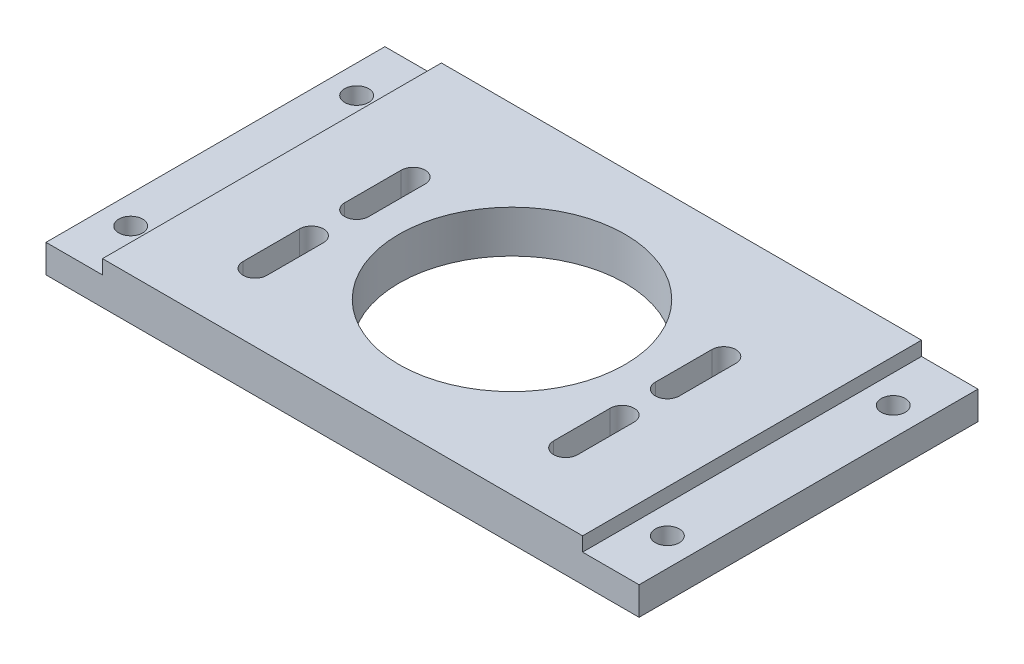
ISO-10303-21;
HEADER;
FILE_DESCRIPTION(('STEP AP214'),'2;1');
FILE_NAME('part.step','',(''),(''),'','','');
FILE_SCHEMA(('AUTOMOTIVE_DESIGN { 1 0 10303 214 1 1 1 1 }'));
ENDSEC;
DATA;
#1=APPLICATION_CONTEXT('core data for automotive mechanical design processes');
#2=APPLICATION_PROTOCOL_DEFINITION('international standard','automotive_design',2000,#1);
#3=PRODUCT_CONTEXT('',#1,'mechanical');
#4=PRODUCT('Part','Part','',(#3));
#5=PRODUCT_RELATED_PRODUCT_CATEGORY('part','',(#4));
#6=PRODUCT_DEFINITION_FORMATION('','',#4);
#7=PRODUCT_DEFINITION_CONTEXT('part definition',#1,'design');
#8=PRODUCT_DEFINITION('design','',#6,#7);
#9=PRODUCT_DEFINITION_SHAPE('','',#8);
#10=(LENGTH_UNIT() NAMED_UNIT(*) SI_UNIT(.MILLI.,.METRE.));
#11=(NAMED_UNIT(*) PLANE_ANGLE_UNIT() SI_UNIT($,.RADIAN.));
#12=(NAMED_UNIT(*) SI_UNIT($,.STERADIAN.) SOLID_ANGLE_UNIT());
#13=UNCERTAINTY_MEASURE_WITH_UNIT(LENGTH_MEASURE(1.E-05),#10,'distance_accuracy_value','');
#14=(GEOMETRIC_REPRESENTATION_CONTEXT(3) GLOBAL_UNCERTAINTY_ASSIGNED_CONTEXT((#13)) GLOBAL_UNIT_ASSIGNED_CONTEXT((#10,
#11,#12)) REPRESENTATION_CONTEXT('',''));
#15=CARTESIAN_POINT('',(0.,0.,0.));
#16=DIRECTION('',(0.,0.,1.));
#17=DIRECTION('',(1.,0.,0.));
#18=AXIS2_PLACEMENT_3D('',#15,#16,#17);
#19=CARTESIAN_POINT('',(0.,0.,120.));
#20=DIRECTION('',(1.,0.,0.));
#21=DIRECTION('',(0.,1.,0.));
#22=AXIS2_PLACEMENT_3D('',#19,#20,#21);
#23=PLANE('',#22);
#24=DIRECTION('',(0.,-1.,0.));
#25=VECTOR('',#24,1.);
#26=CARTESIAN_POINT('',(0.,0.,0.));
#27=LINE('',#26,#25);
#28=CARTESIAN_POINT('',(0.,10.,0.));
#29=VERTEX_POINT('',#28);
#30=CARTESIAN_POINT('',(0.,0.,0.));
#31=VERTEX_POINT('',#30);
#32=EDGE_CURVE('E367',#29,#31,#27,.T.);
#33=ORIENTED_EDGE('',*,*,#32,.T.);
#34=DIRECTION('',(0.,0.,-1.));
#35=VECTOR('',#34,1.);
#36=CARTESIAN_POINT('',(0.,0.,120.));
#37=LINE('',#36,#35);
#38=CARTESIAN_POINT('',(0.,0.,120.));
#39=VERTEX_POINT('',#38);
#40=EDGE_CURVE('E11',#39,#31,#37,.T.);
#41=ORIENTED_EDGE('',*,*,#40,.F.);
#42=DIRECTION('',(0.,-1.,0.));
#43=VECTOR('',#42,1.);
#44=CARTESIAN_POINT('',(0.,0.,120.));
#45=LINE('',#44,#43);
#46=CARTESIAN_POINT('',(0.,10.,120.));
#47=VERTEX_POINT('',#46);
#48=EDGE_CURVE('E348',#47,#39,#45,.T.);
#49=ORIENTED_EDGE('',*,*,#48,.F.);
#50=DIRECTION('',(0.,0.,-1.));
#51=VECTOR('',#50,1.);
#52=CARTESIAN_POINT('',(0.,10.,120.));
#53=LINE('',#52,#51);
#54=EDGE_CURVE('E366',#47,#29,#53,.T.);
#55=ORIENTED_EDGE('',*,*,#54,.T.);
#56=EDGE_LOOP('',(#33,#41,#49,#55));
#57=FACE_BOUND('',#56,.T.);
#58=ADVANCED_FACE('F34',(#57),#23,.F.);
#59=CARTESIAN_POINT('',(0.,0.,120.));
#60=DIRECTION('',(0.,1.,0.));
#61=DIRECTION('',(0.,0.,1.));
#62=AXIS2_PLACEMENT_3D('',#59,#60,#61);
#63=PLANE('',#62);
#64=DIRECTION('',(0.,0.,-1.));
#65=VECTOR('',#64,1.);
#66=CARTESIAN_POINT('',(155.75,0.,60.));
#67=LINE('',#66,#65);
#68=CARTESIAN_POINT('',(155.75,0.,60.));
#69=VERTEX_POINT('',#68);
#70=CARTESIAN_POINT('',(155.75,0.,40.));
#71=VERTEX_POINT('',#70);
#72=EDGE_CURVE('E218',#69,#71,#67,.T.);
#73=ORIENTED_EDGE('',*,*,#72,.F.);
#74=CARTESIAN_POINT('',(160.,0.,60.));
#75=DIRECTION('',(0.,-1.,0.));
#76=DIRECTION('',(0.,0.,-1.));
#77=AXIS2_PLACEMENT_3D('',#74,#75,#76);
#78=CIRCLE('',#77,4.25);
#79=CARTESIAN_POINT('',(164.25,0.,60.));
#80=VERTEX_POINT('',#79);
#81=EDGE_CURVE('E50',#80,#69,#78,.T.);
#82=ORIENTED_EDGE('',*,*,#81,.F.);
#83=DIRECTION('',(0.,0.,1.));
#84=VECTOR('',#83,1.);
#85=CARTESIAN_POINT('',(164.25,0.,60.));
#86=LINE('',#85,#84);
#87=CARTESIAN_POINT('',(164.25,0.,40.));
#88=VERTEX_POINT('',#87);
#89=EDGE_CURVE('E204',#88,#80,#86,.T.);
#90=ORIENTED_EDGE('',*,*,#89,.F.);
#91=CARTESIAN_POINT('',(160.,0.,40.));
#92=DIRECTION('',(0.,-1.,0.));
#93=DIRECTION('',(0.,0.,-1.));
#94=AXIS2_PLACEMENT_3D('',#91,#92,#93);
#95=CIRCLE('',#94,4.25);
#96=EDGE_CURVE('E224',#71,#88,#95,.T.);
#97=ORIENTED_EDGE('',*,*,#96,.F.);
#98=EDGE_LOOP('',(#73,#82,#90,#97));
#99=FACE_BOUND('',#98,.T.);
#100=DIRECTION('',(0.,0.,-1.));
#101=VECTOR('',#100,1.);
#102=CARTESIAN_POINT('',(45.7500000000004,0.,60.));
#103=LINE('',#102,#101);
#104=CARTESIAN_POINT('',(45.7500000000004,0.,60.));
#105=VERTEX_POINT('',#104);
#106=CARTESIAN_POINT('',(45.7500000000004,0.,40.));
#107=VERTEX_POINT('',#106);
#108=EDGE_CURVE('E242',#105,#107,#103,.T.);
#109=ORIENTED_EDGE('',*,*,#108,.F.);
#110=CARTESIAN_POINT('',(50.0000000000004,0.,60.));
#111=DIRECTION('',(0.,-1.,0.));
#112=DIRECTION('',(0.,0.,-1.));
#113=AXIS2_PLACEMENT_3D('',#110,#111,#112);
#114=CIRCLE('',#113,4.25);
#115=CARTESIAN_POINT('',(54.2500000000004,0.,60.));
#116=VERTEX_POINT('',#115);
#117=EDGE_CURVE('E240',#116,#105,#114,.T.);
#118=ORIENTED_EDGE('',*,*,#117,.F.);
#119=DIRECTION('',(0.,0.,1.));
#120=VECTOR('',#119,1.);
#121=CARTESIAN_POINT('',(54.2500000000004,0.,60.));
#122=LINE('',#121,#120);
#123=CARTESIAN_POINT('',(54.2500000000004,0.,40.));
#124=VERTEX_POINT('',#123);
#125=EDGE_CURVE('E248',#124,#116,#122,.T.);
#126=ORIENTED_EDGE('',*,*,#125,.F.);
#127=CARTESIAN_POINT('',(50.0000000000004,0.,40.));
#128=DIRECTION('',(0.,-1.,0.));
#129=DIRECTION('',(0.,0.,-1.));
#130=AXIS2_PLACEMENT_3D('',#127,#128,#129);
#131=CIRCLE('',#130,4.25);
#132=EDGE_CURVE('E245',#107,#124,#131,.T.);
#133=ORIENTED_EDGE('',*,*,#132,.F.);
#134=EDGE_LOOP('',(#109,#118,#126,#133));
#135=FACE_BOUND('',#134,.T.);
#136=DIRECTION('',(0.,0.,-1.));
#137=VECTOR('',#136,1.);
#138=CARTESIAN_POINT('',(155.75,0.,96.));
#139=LINE('',#138,#137);
#140=CARTESIAN_POINT('',(155.75,0.,96.));
#141=VERTEX_POINT('',#140);
#142=CARTESIAN_POINT('',(155.75,0.,76.));
#143=VERTEX_POINT('',#142);
#144=EDGE_CURVE('E273',#141,#143,#139,.T.);
#145=ORIENTED_EDGE('',*,*,#144,.F.);
#146=CARTESIAN_POINT('',(160.,0.,96.));
#147=DIRECTION('',(0.,-1.,0.));
#148=DIRECTION('',(0.,0.,-1.));
#149=AXIS2_PLACEMENT_3D('',#146,#147,#148);
#150=CIRCLE('',#149,4.25);
#151=CARTESIAN_POINT('',(164.25,0.,96.));
#152=VERTEX_POINT('',#151);
#153=EDGE_CURVE('E271',#152,#141,#150,.T.);
#154=ORIENTED_EDGE('',*,*,#153,.F.);
#155=DIRECTION('',(0.,0.,1.));
#156=VECTOR('',#155,1.);
#157=CARTESIAN_POINT('',(164.25,0.,96.));
#158=LINE('',#157,#156);
#159=CARTESIAN_POINT('',(164.25,0.,76.));
#160=VERTEX_POINT('',#159);
#161=EDGE_CURVE('E279',#160,#152,#158,.T.);
#162=ORIENTED_EDGE('',*,*,#161,.F.);
#163=CARTESIAN_POINT('',(160.,0.,76.));
#164=DIRECTION('',(0.,-1.,0.));
#165=DIRECTION('',(0.,0.,-1.));
#166=AXIS2_PLACEMENT_3D('',#163,#164,#165);
#167=CIRCLE('',#166,4.25);
#168=EDGE_CURVE('E276',#143,#160,#167,.T.);
#169=ORIENTED_EDGE('',*,*,#168,.F.);
#170=EDGE_LOOP('',(#145,#154,#162,#169));
#171=FACE_BOUND('',#170,.T.);
#172=DIRECTION('',(0.,0.,-1.));
#173=VECTOR('',#172,1.);
#174=CARTESIAN_POINT('',(45.75,0.,96.));
#175=LINE('',#174,#173);
#176=CARTESIAN_POINT('',(45.75,0.,96.));
#177=VERTEX_POINT('',#176);
#178=CARTESIAN_POINT('',(45.75,0.,76.));
#179=VERTEX_POINT('',#178);
#180=EDGE_CURVE('E304',#177,#179,#175,.T.);
#181=ORIENTED_EDGE('',*,*,#180,.F.);
#182=CARTESIAN_POINT('',(50.,0.,96.));
#183=DIRECTION('',(0.,-1.,0.));
#184=DIRECTION('',(0.,0.,-1.));
#185=AXIS2_PLACEMENT_3D('',#182,#183,#184);
#186=CIRCLE('',#185,4.25);
#187=CARTESIAN_POINT('',(54.25,0.,96.));
#188=VERTEX_POINT('',#187);
#189=EDGE_CURVE('E302',#188,#177,#186,.T.);
#190=ORIENTED_EDGE('',*,*,#189,.F.);
#191=DIRECTION('',(0.,0.,1.));
#192=VECTOR('',#191,1.);
#193=CARTESIAN_POINT('',(54.25,0.,96.));
#194=LINE('',#193,#192);
#195=CARTESIAN_POINT('',(54.25,0.,76.));
#196=VERTEX_POINT('',#195);
#197=EDGE_CURVE('E310',#196,#188,#194,.T.);
#198=ORIENTED_EDGE('',*,*,#197,.F.);
#199=CARTESIAN_POINT('',(50.,0.,76.));
#200=DIRECTION('',(0.,-1.,0.));
#201=DIRECTION('',(0.,0.,-1.));
#202=AXIS2_PLACEMENT_3D('',#199,#200,#201);
#203=CIRCLE('',#202,4.25);
#204=EDGE_CURVE('E307',#179,#196,#203,.T.);
#205=ORIENTED_EDGE('',*,*,#204,.F.);
#206=EDGE_LOOP('',(#181,#190,#198,#205));
#207=FACE_BOUND('',#206,.T.);
#208=CARTESIAN_POINT('',(105.,0.,60.));
#209=DIRECTION('',(0.,-1.,0.));
#210=DIRECTION('',(0.,0.,-1.));
#211=AXIS2_PLACEMENT_3D('',#208,#209,#210);
#212=CIRCLE('',#211,40.);
#213=CARTESIAN_POINT('',(105.,0.,20.));
#214=VERTEX_POINT('',#213);
#215=EDGE_CURVE('E325',#214,#214,#212,.T.);
#216=ORIENTED_EDGE('',*,*,#215,.F.);
#217=EDGE_LOOP('',(#216));
#218=FACE_BOUND('',#217,.T.);
#219=CARTESIAN_POINT('',(200.,0.,100.));
#220=DIRECTION('',(0.,-1.,0.));
#221=DIRECTION('',(0.,0.,-1.));
#222=AXIS2_PLACEMENT_3D('',#219,#220,#221);
#223=CIRCLE('',#222,4.24999999999998);
#224=CARTESIAN_POINT('',(200.,0.,95.75));
#225=VERTEX_POINT('',#224);
#226=EDGE_CURVE('E331',#225,#225,#223,.T.);
#227=ORIENTED_EDGE('',*,*,#226,.F.);
#228=EDGE_LOOP('',(#227));
#229=FACE_BOUND('',#228,.T.);
#230=CARTESIAN_POINT('',(200.,0.,20.));
#231=DIRECTION('',(0.,-1.,0.));
#232=DIRECTION('',(0.,0.,-1.));
#233=AXIS2_PLACEMENT_3D('',#230,#231,#232);
#234=CIRCLE('',#233,4.24999999999998);
#235=CARTESIAN_POINT('',(200.,0.,15.75));
#236=VERTEX_POINT('',#235);
#237=EDGE_CURVE('E334',#236,#236,#234,.T.);
#238=ORIENTED_EDGE('',*,*,#237,.F.);
#239=EDGE_LOOP('',(#238));
#240=FACE_BOUND('',#239,.T.);
#241=CARTESIAN_POINT('',(10.,0.,100.));
#242=DIRECTION('',(0.,-1.,0.));
#243=DIRECTION('',(0.,0.,-1.));
#244=AXIS2_PLACEMENT_3D('',#241,#242,#243);
#245=CIRCLE('',#244,4.24999999999999);
#246=CARTESIAN_POINT('',(10.,0.,95.75));
#247=VERTEX_POINT('',#246);
#248=EDGE_CURVE('E340',#247,#247,#245,.T.);
#249=ORIENTED_EDGE('',*,*,#248,.F.);
#250=EDGE_LOOP('',(#249));
#251=FACE_BOUND('',#250,.T.);
#252=CARTESIAN_POINT('',(10.,0.,20.));
#253=DIRECTION('',(0.,-1.,0.));
#254=DIRECTION('',(0.,0.,-1.));
#255=AXIS2_PLACEMENT_3D('',#252,#253,#254);
#256=CIRCLE('',#255,4.24999999999999);
#257=CARTESIAN_POINT('',(10.,0.,15.75));
#258=VERTEX_POINT('',#257);
#259=EDGE_CURVE('E344',#258,#258,#256,.T.);
#260=ORIENTED_EDGE('',*,*,#259,.F.);
#261=EDGE_LOOP('',(#260));
#262=FACE_BOUND('',#261,.T.);
#263=DIRECTION('',(1.,0.,0.));
#264=VECTOR('',#263,1.);
#265=CARTESIAN_POINT('',(0.,0.,0.));
#266=LINE('',#265,#264);
#267=CARTESIAN_POINT('',(210.,0.,0.));
#268=VERTEX_POINT('',#267);
#269=EDGE_CURVE('E370',#31,#268,#266,.T.);
#270=ORIENTED_EDGE('',*,*,#269,.T.);
#271=DIRECTION('',(0.,0.,-1.));
#272=VECTOR('',#271,1.);
#273=CARTESIAN_POINT('',(210.,0.,120.));
#274=LINE('',#273,#272);
#275=CARTESIAN_POINT('',(210.,0.,120.));
#276=VERTEX_POINT('',#275);
#277=EDGE_CURVE('E42',#276,#268,#274,.T.);
#278=ORIENTED_EDGE('',*,*,#277,.F.);
#279=DIRECTION('',(1.,0.,0.));
#280=VECTOR('',#279,1.);
#281=CARTESIAN_POINT('',(0.,0.,120.));
#282=LINE('',#281,#280);
#283=EDGE_CURVE('E351',#39,#276,#282,.T.);
#284=ORIENTED_EDGE('',*,*,#283,.F.);
#285=ORIENTED_EDGE('',*,*,#40,.T.);
#286=EDGE_LOOP('',(#270,#278,#284,#285));
#287=FACE_BOUND('',#286,.T.);
#288=ADVANCED_FACE('F426',(#99,#135,#171,#207,#218,#229,#240,#251,#262,#287),#63,.F.);
#289=CARTESIAN_POINT('',(210.,0.,120.));
#290=DIRECTION('',(-1.,0.,0.));
#291=DIRECTION('',(0.,0.,1.));
#292=AXIS2_PLACEMENT_3D('',#289,#290,#291);
#293=PLANE('',#292);
#294=DIRECTION('',(0.,1.,0.));
#295=VECTOR('',#294,1.);
#296=CARTESIAN_POINT('',(210.,0.,0.));
#297=LINE('',#296,#295);
#298=CARTESIAN_POINT('',(210.,10.,0.));
#299=VERTEX_POINT('',#298);
#300=EDGE_CURVE('E372',#268,#299,#297,.T.);
#301=ORIENTED_EDGE('',*,*,#300,.T.);
#302=DIRECTION('',(0.,0.,-1.));
#303=VECTOR('',#302,1.);
#304=CARTESIAN_POINT('',(210.,10.,120.));
#305=LINE('',#304,#303);
#306=CARTESIAN_POINT('',(210.,10.,120.));
#307=VERTEX_POINT('',#306);
#308=EDGE_CURVE('E397',#307,#299,#305,.T.);
#309=ORIENTED_EDGE('',*,*,#308,.F.);
#310=DIRECTION('',(0.,1.,0.));
#311=VECTOR('',#310,1.);
#312=CARTESIAN_POINT('',(210.,0.,120.));
#313=LINE('',#312,#311);
#314=EDGE_CURVE('E354',#276,#307,#313,.T.);
#315=ORIENTED_EDGE('',*,*,#314,.F.);
#316=ORIENTED_EDGE('',*,*,#277,.T.);
#317=EDGE_LOOP('',(#301,#309,#315,#316));
#318=FACE_BOUND('',#317,.T.);
#319=ADVANCED_FACE('F431',(#318),#293,.F.);
#320=CARTESIAN_POINT('',(210.,10.,120.));
#321=DIRECTION('',(0.,-1.,0.));
#322=DIRECTION('',(1.,0.,0.));
#323=AXIS2_PLACEMENT_3D('',#320,#321,#322);
#324=PLANE('',#323);
#325=CARTESIAN_POINT('',(200.,9.99999999999999,100.));
#326=DIRECTION('',(0.,-1.,0.));
#327=DIRECTION('',(1.,0.,0.));
#328=AXIS2_PLACEMENT_3D('',#325,#326,#327);
#329=CIRCLE('',#328,4.24999999999999);
#330=CARTESIAN_POINT('',(204.25,9.99999999999999,100.));
#331=VERTEX_POINT('',#330);
#332=EDGE_CURVE('E37',#331,#331,#329,.T.);
#333=ORIENTED_EDGE('',*,*,#332,.T.);
#334=EDGE_LOOP('',(#333));
#335=FACE_BOUND('',#334,.T.);
#336=CARTESIAN_POINT('',(200.,9.99999999999999,20.));
#337=DIRECTION('',(0.,-1.,0.));
#338=DIRECTION('',(1.,0.,0.));
#339=AXIS2_PLACEMENT_3D('',#336,#337,#338);
#340=CIRCLE('',#339,4.24999999999999);
#341=CARTESIAN_POINT('',(204.25,9.99999999999999,20.));
#342=VERTEX_POINT('',#341);
#343=EDGE_CURVE('E337',#342,#342,#340,.T.);
#344=ORIENTED_EDGE('',*,*,#343,.T.);
#345=EDGE_LOOP('',(#344));
#346=FACE_BOUND('',#345,.T.);
#347=DIRECTION('',(-1.,0.,0.));
#348=VECTOR('',#347,1.);
#349=CARTESIAN_POINT('',(210.,10.,0.));
#350=LINE('',#349,#348);
#351=CARTESIAN_POINT('',(190.,9.99999999999999,0.));
#352=VERTEX_POINT('',#351);
#353=EDGE_CURVE('E374',#299,#352,#350,.T.);
#354=ORIENTED_EDGE('',*,*,#353,.T.);
#355=DIRECTION('',(0.,0.,-1.));
#356=VECTOR('',#355,1.);
#357=CARTESIAN_POINT('',(190.,9.99999999999999,120.));
#358=LINE('',#357,#356);
#359=CARTESIAN_POINT('',(190.,9.99999999999999,120.));
#360=VERTEX_POINT('',#359);
#361=EDGE_CURVE('E394',#360,#352,#358,.T.);
#362=ORIENTED_EDGE('',*,*,#361,.F.);
#363=DIRECTION('',(-1.,0.,0.));
#364=VECTOR('',#363,1.);
#365=CARTESIAN_POINT('',(210.,10.,120.));
#366=LINE('',#365,#364);
#367=EDGE_CURVE('E356',#307,#360,#366,.T.);
#368=ORIENTED_EDGE('',*,*,#367,.F.);
#369=ORIENTED_EDGE('',*,*,#308,.T.);
#370=EDGE_LOOP('',(#354,#362,#368,#369));
#371=FACE_BOUND('',#370,.T.);
#372=ADVANCED_FACE('F465',(#335,#346,#371),#324,.F.);
#373=CARTESIAN_POINT('',(190.,15.,120.));
#374=DIRECTION('',(-1.,0.,0.));
#375=DIRECTION('',(0.,0.,1.));
#376=AXIS2_PLACEMENT_3D('',#373,#374,#375);
#377=PLANE('',#376);
#378=DIRECTION('',(0.,1.,0.));
#379=VECTOR('',#378,1.);
#380=CARTESIAN_POINT('',(190.,15.,0.));
#381=LINE('',#380,#379);
#382=CARTESIAN_POINT('',(190.,15.,0.));
#383=VERTEX_POINT('',#382);
#384=EDGE_CURVE('E376',#352,#383,#381,.T.);
#385=ORIENTED_EDGE('',*,*,#384,.T.);
#386=DIRECTION('',(0.,0.,-1.));
#387=VECTOR('',#386,1.);
#388=CARTESIAN_POINT('',(190.,15.,120.));
#389=LINE('',#388,#387);
#390=CARTESIAN_POINT('',(190.,15.,120.));
#391=VERTEX_POINT('',#390);
#392=EDGE_CURVE('E391',#391,#383,#389,.T.);
#393=ORIENTED_EDGE('',*,*,#392,.F.);
#394=DIRECTION('',(0.,1.,0.));
#395=VECTOR('',#394,1.);
#396=CARTESIAN_POINT('',(190.,15.,120.));
#397=LINE('',#396,#395);
#398=EDGE_CURVE('E358',#360,#391,#397,.T.);
#399=ORIENTED_EDGE('',*,*,#398,.F.);
#400=ORIENTED_EDGE('',*,*,#361,.T.);
#401=EDGE_LOOP('',(#385,#393,#399,#400));
#402=FACE_BOUND('',#401,.T.);
#403=ADVANCED_FACE('F461',(#402),#377,.F.);
#404=CARTESIAN_POINT('',(20.,15.,120.));
#405=DIRECTION('',(0.,-1.,0.));
#406=DIRECTION('',(0.,0.,-1.));
#407=AXIS2_PLACEMENT_3D('',#404,#405,#406);
#408=PLANE('',#407);
#409=DIRECTION('',(0.,0.,-1.));
#410=VECTOR('',#409,1.);
#411=CARTESIAN_POINT('',(164.25,15.,60.));
#412=LINE('',#411,#410);
#413=CARTESIAN_POINT('',(164.25,15.,60.));
#414=VERTEX_POINT('',#413);
#415=CARTESIAN_POINT('',(164.25,15.,40.));
#416=VERTEX_POINT('',#415);
#417=EDGE_CURVE('E216',#414,#416,#412,.T.);
#418=ORIENTED_EDGE('',*,*,#417,.F.);
#419=CARTESIAN_POINT('',(160.,15.,60.));
#420=DIRECTION('',(0.,-1.,0.));
#421=DIRECTION('',(0.,0.,-1.));
#422=AXIS2_PLACEMENT_3D('',#419,#420,#421);
#423=CIRCLE('',#422,4.25);
#424=CARTESIAN_POINT('',(155.75,15.,60.));
#425=VERTEX_POINT('',#424);
#426=EDGE_CURVE('E198',#425,#414,#423,.F.);
#427=ORIENTED_EDGE('',*,*,#426,.F.);
#428=DIRECTION('',(0.,0.,1.));
#429=VECTOR('',#428,1.);
#430=CARTESIAN_POINT('',(155.75,15.,60.));
#431=LINE('',#430,#429);
#432=CARTESIAN_POINT('',(155.75,15.,40.));
#433=VERTEX_POINT('',#432);
#434=EDGE_CURVE('E207',#433,#425,#431,.T.);
#435=ORIENTED_EDGE('',*,*,#434,.F.);
#436=CARTESIAN_POINT('',(160.,15.,40.));
#437=DIRECTION('',(0.,-1.,0.));
#438=DIRECTION('',(0.,0.,-1.));
#439=AXIS2_PLACEMENT_3D('',#436,#437,#438);
#440=CIRCLE('',#439,4.25);
#441=EDGE_CURVE('E58',#416,#433,#440,.F.);
#442=ORIENTED_EDGE('',*,*,#441,.F.);
#443=EDGE_LOOP('',(#418,#427,#435,#442));
#444=FACE_BOUND('',#443,.T.);
#445=DIRECTION('',(0.,0.,-1.));
#446=VECTOR('',#445,1.);
#447=CARTESIAN_POINT('',(54.2500000000004,15.,60.));
#448=LINE('',#447,#446);
#449=CARTESIAN_POINT('',(54.2500000000004,15.,60.));
#450=VERTEX_POINT('',#449);
#451=CARTESIAN_POINT('',(54.2500000000004,15.,40.));
#452=VERTEX_POINT('',#451);
#453=EDGE_CURVE('E234',#450,#452,#448,.T.);
#454=ORIENTED_EDGE('',*,*,#453,.F.);
#455=CARTESIAN_POINT('',(50.0000000000004,15.,60.));
#456=DIRECTION('',(0.,-1.,0.));
#457=DIRECTION('',(0.,0.,-1.));
#458=AXIS2_PLACEMENT_3D('',#455,#456,#457);
#459=CIRCLE('',#458,4.25);
#460=CARTESIAN_POINT('',(45.7500000000004,15.,60.));
#461=VERTEX_POINT('',#460);
#462=EDGE_CURVE('E237',#461,#450,#459,.F.);
#463=ORIENTED_EDGE('',*,*,#462,.F.);
#464=DIRECTION('',(0.,0.,1.));
#465=VECTOR('',#464,1.);
#466=CARTESIAN_POINT('',(45.7500000000004,15.,60.));
#467=LINE('',#466,#465);
#468=CARTESIAN_POINT('',(45.7500000000004,15.,40.));
#469=VERTEX_POINT('',#468);
#470=EDGE_CURVE('E254',#469,#461,#467,.T.);
#471=ORIENTED_EDGE('',*,*,#470,.F.);
#472=CARTESIAN_POINT('',(50.0000000000004,15.,40.));
#473=DIRECTION('',(0.,-1.,0.));
#474=DIRECTION('',(0.,0.,-1.));
#475=AXIS2_PLACEMENT_3D('',#472,#473,#474);
#476=CIRCLE('',#475,4.25);
#477=EDGE_CURVE('E210',#452,#469,#476,.F.);
#478=ORIENTED_EDGE('',*,*,#477,.F.);
#479=EDGE_LOOP('',(#454,#463,#471,#478));
#480=FACE_BOUND('',#479,.T.);
#481=DIRECTION('',(0.,0.,-1.));
#482=VECTOR('',#481,1.);
#483=CARTESIAN_POINT('',(164.25,15.,96.));
#484=LINE('',#483,#482);
#485=CARTESIAN_POINT('',(164.25,15.,96.));
#486=VERTEX_POINT('',#485);
#487=CARTESIAN_POINT('',(164.25,15.,76.));
#488=VERTEX_POINT('',#487);
#489=EDGE_CURVE('E265',#486,#488,#484,.T.);
#490=ORIENTED_EDGE('',*,*,#489,.F.);
#491=CARTESIAN_POINT('',(160.,15.,96.));
#492=DIRECTION('',(0.,-1.,0.));
#493=DIRECTION('',(0.,0.,-1.));
#494=AXIS2_PLACEMENT_3D('',#491,#492,#493);
#495=CIRCLE('',#494,4.25);
#496=CARTESIAN_POINT('',(155.75,15.,96.));
#497=VERTEX_POINT('',#496);
#498=EDGE_CURVE('E268',#497,#486,#495,.F.);
#499=ORIENTED_EDGE('',*,*,#498,.F.);
#500=DIRECTION('',(0.,0.,1.));
#501=VECTOR('',#500,1.);
#502=CARTESIAN_POINT('',(155.75,15.,96.));
#503=LINE('',#502,#501);
#504=CARTESIAN_POINT('',(155.75,15.,76.));
#505=VERTEX_POINT('',#504);
#506=EDGE_CURVE('E285',#505,#497,#503,.T.);
#507=ORIENTED_EDGE('',*,*,#506,.F.);
#508=CARTESIAN_POINT('',(160.,15.,76.));
#509=DIRECTION('',(0.,-1.,0.));
#510=DIRECTION('',(0.,0.,-1.));
#511=AXIS2_PLACEMENT_3D('',#508,#509,#510);
#512=CIRCLE('',#511,4.25);
#513=EDGE_CURVE('E263',#488,#505,#512,.F.);
#514=ORIENTED_EDGE('',*,*,#513,.F.);
#515=EDGE_LOOP('',(#490,#499,#507,#514));
#516=FACE_BOUND('',#515,.T.);
#517=DIRECTION('',(0.,0.,-1.));
#518=VECTOR('',#517,1.);
#519=CARTESIAN_POINT('',(54.25,15.,96.));
#520=LINE('',#519,#518);
#521=CARTESIAN_POINT('',(54.25,15.,96.));
#522=VERTEX_POINT('',#521);
#523=CARTESIAN_POINT('',(54.25,15.,76.));
#524=VERTEX_POINT('',#523);
#525=EDGE_CURVE('E296',#522,#524,#520,.T.);
#526=ORIENTED_EDGE('',*,*,#525,.F.);
#527=CARTESIAN_POINT('',(50.,15.,96.));
#528=DIRECTION('',(0.,-1.,0.));
#529=DIRECTION('',(0.,0.,-1.));
#530=AXIS2_PLACEMENT_3D('',#527,#528,#529);
#531=CIRCLE('',#530,4.25);
#532=CARTESIAN_POINT('',(45.75,15.,96.));
#533=VERTEX_POINT('',#532);
#534=EDGE_CURVE('E299',#533,#522,#531,.F.);
#535=ORIENTED_EDGE('',*,*,#534,.F.);
#536=DIRECTION('',(0.,0.,1.));
#537=VECTOR('',#536,1.);
#538=CARTESIAN_POINT('',(45.75,15.,96.));
#539=LINE('',#538,#537);
#540=CARTESIAN_POINT('',(45.75,15.,76.));
#541=VERTEX_POINT('',#540);
#542=EDGE_CURVE('E316',#541,#533,#539,.T.);
#543=ORIENTED_EDGE('',*,*,#542,.F.);
#544=CARTESIAN_POINT('',(50.,15.,76.));
#545=DIRECTION('',(0.,-1.,0.));
#546=DIRECTION('',(0.,0.,-1.));
#547=AXIS2_PLACEMENT_3D('',#544,#545,#546);
#548=CIRCLE('',#547,4.25);
#549=EDGE_CURVE('E294',#524,#541,#548,.F.);
#550=ORIENTED_EDGE('',*,*,#549,.F.);
#551=EDGE_LOOP('',(#526,#535,#543,#550));
#552=FACE_BOUND('',#551,.T.);
#553=CARTESIAN_POINT('',(105.,15.,60.));
#554=DIRECTION('',(0.,-1.,0.));
#555=DIRECTION('',(0.,0.,-1.));
#556=AXIS2_PLACEMENT_3D('',#553,#554,#555);
#557=CIRCLE('',#556,40.);
#558=CARTESIAN_POINT('',(105.,15.,20.));
#559=VERTEX_POINT('',#558);
#560=EDGE_CURVE('E328',#559,#559,#557,.F.);
#561=ORIENTED_EDGE('',*,*,#560,.F.);
#562=EDGE_LOOP('',(#561));
#563=FACE_BOUND('',#562,.T.);
#564=DIRECTION('',(-1.,0.,0.));
#565=VECTOR('',#564,1.);
#566=CARTESIAN_POINT('',(20.,15.,0.));
#567=LINE('',#566,#565);
#568=CARTESIAN_POINT('',(20.,15.,0.));
#569=VERTEX_POINT('',#568);
#570=EDGE_CURVE('E378',#383,#569,#567,.T.);
#571=ORIENTED_EDGE('',*,*,#570,.T.);
#572=DIRECTION('',(0.,0.,-1.));
#573=VECTOR('',#572,1.);
#574=CARTESIAN_POINT('',(20.,15.,120.));
#575=LINE('',#574,#573);
#576=CARTESIAN_POINT('',(20.,15.,120.));
#577=VERTEX_POINT('',#576);
#578=EDGE_CURVE('E388',#577,#569,#575,.T.);
#579=ORIENTED_EDGE('',*,*,#578,.F.);
#580=DIRECTION('',(-1.,0.,0.));
#581=VECTOR('',#580,1.);
#582=CARTESIAN_POINT('',(20.,15.,120.));
#583=LINE('',#582,#581);
#584=EDGE_CURVE('E360',#391,#577,#583,.T.);
#585=ORIENTED_EDGE('',*,*,#584,.F.);
#586=ORIENTED_EDGE('',*,*,#392,.T.);
#587=EDGE_LOOP('',(#571,#579,#585,#586));
#588=FACE_BOUND('',#587,.T.);
#589=ADVANCED_FACE('F213',(#444,#480,#516,#552,#563,#588),#408,.F.);
#590=CARTESIAN_POINT('',(20.,15.,120.));
#591=DIRECTION('',(1.,0.,0.));
#592=DIRECTION('',(0.,0.,-1.));
#593=AXIS2_PLACEMENT_3D('',#590,#591,#592);
#594=PLANE('',#593);
#595=DIRECTION('',(0.,-1.,0.));
#596=VECTOR('',#595,1.);
#597=CARTESIAN_POINT('',(20.,15.,0.));
#598=LINE('',#597,#596);
#599=CARTESIAN_POINT('',(20.,10.,0.));
#600=VERTEX_POINT('',#599);
#601=EDGE_CURVE('E380',#569,#600,#598,.T.);
#602=ORIENTED_EDGE('',*,*,#601,.T.);
#603=DIRECTION('',(0.,0.,-1.));
#604=VECTOR('',#603,1.);
#605=CARTESIAN_POINT('',(20.,10.,120.));
#606=LINE('',#605,#604);
#607=CARTESIAN_POINT('',(20.,10.,120.));
#608=VERTEX_POINT('',#607);
#609=EDGE_CURVE('E385',#608,#600,#606,.T.);
#610=ORIENTED_EDGE('',*,*,#609,.F.);
#611=DIRECTION('',(0.,-1.,0.));
#612=VECTOR('',#611,1.);
#613=CARTESIAN_POINT('',(20.,15.,120.));
#614=LINE('',#613,#612);
#615=EDGE_CURVE('E362',#577,#608,#614,.T.);
#616=ORIENTED_EDGE('',*,*,#615,.F.);
#617=ORIENTED_EDGE('',*,*,#578,.T.);
#618=EDGE_LOOP('',(#602,#610,#616,#617));
#619=FACE_BOUND('',#618,.T.);
#620=ADVANCED_FACE('F452',(#619),#594,.F.);
#621=CARTESIAN_POINT('',(0.,10.,120.));
#622=DIRECTION('',(0.,-1.,0.));
#623=DIRECTION('',(0.,0.,-1.));
#624=AXIS2_PLACEMENT_3D('',#621,#622,#623);
#625=PLANE('',#624);
#626=CARTESIAN_POINT('',(10.,10.,100.));
#627=DIRECTION('',(0.,-1.,0.));
#628=DIRECTION('',(0.,0.,-1.));
#629=AXIS2_PLACEMENT_3D('',#626,#627,#628);
#630=CIRCLE('',#629,4.24999999999999);
#631=CARTESIAN_POINT('',(10.,10.,95.75));
#632=VERTEX_POINT('',#631);
#633=EDGE_CURVE('E343',#632,#632,#630,.T.);
#634=ORIENTED_EDGE('',*,*,#633,.T.);
#635=EDGE_LOOP('',(#634));
#636=FACE_BOUND('',#635,.T.);
#637=CARTESIAN_POINT('',(10.,10.,20.));
#638=DIRECTION('',(0.,-1.,0.));
#639=DIRECTION('',(0.,0.,-1.));
#640=AXIS2_PLACEMENT_3D('',#637,#638,#639);
#641=CIRCLE('',#640,4.24999999999999);
#642=CARTESIAN_POINT('',(10.,10.,15.75));
#643=VERTEX_POINT('',#642);
#644=EDGE_CURVE('E347',#643,#643,#641,.T.);
#645=ORIENTED_EDGE('',*,*,#644,.T.);
#646=EDGE_LOOP('',(#645));
#647=FACE_BOUND('',#646,.T.);
#648=DIRECTION('',(-1.,0.,0.));
#649=VECTOR('',#648,1.);
#650=CARTESIAN_POINT('',(0.,10.,0.));
#651=LINE('',#650,#649);
#652=EDGE_CURVE('E352',#600,#29,#651,.T.);
#653=ORIENTED_EDGE('',*,*,#652,.T.);
#654=ORIENTED_EDGE('',*,*,#54,.F.);
#655=DIRECTION('',(-1.,0.,0.));
#656=VECTOR('',#655,1.);
#657=CARTESIAN_POINT('',(0.,10.,120.));
#658=LINE('',#657,#656);
#659=EDGE_CURVE('E364',#608,#47,#658,.T.);
#660=ORIENTED_EDGE('',*,*,#659,.F.);
#661=ORIENTED_EDGE('',*,*,#609,.T.);
#662=EDGE_LOOP('',(#653,#654,#660,#661));
#663=FACE_BOUND('',#662,.T.);
#664=ADVANCED_FACE('F406',(#636,#647,#663),#625,.F.);
#665=CARTESIAN_POINT('',(0.,10.,120.));
#666=DIRECTION('',(0.,0.,-1.));
#667=DIRECTION('',(-1.,0.,0.));
#668=AXIS2_PLACEMENT_3D('',#665,#666,#667);
#669=PLANE('',#668);
#670=ORIENTED_EDGE('',*,*,#48,.T.);
#671=ORIENTED_EDGE('',*,*,#283,.T.);
#672=ORIENTED_EDGE('',*,*,#314,.T.);
#673=ORIENTED_EDGE('',*,*,#367,.T.);
#674=ORIENTED_EDGE('',*,*,#398,.T.);
#675=ORIENTED_EDGE('',*,*,#584,.T.);
#676=ORIENTED_EDGE('',*,*,#615,.T.);
#677=ORIENTED_EDGE('',*,*,#659,.T.);
#678=EDGE_LOOP('',(#670,#671,#672,#673,#674,#675,#676,#677));
#679=FACE_BOUND('',#678,.T.);
#680=ADVANCED_FACE('F446',(#679),#669,.F.);
#681=CARTESIAN_POINT('',(0.,10.,0.));
#682=DIRECTION('',(0.,0.,-1.));
#683=DIRECTION('',(-1.,0.,0.));
#684=AXIS2_PLACEMENT_3D('',#681,#682,#683);
#685=PLANE('',#684);
#686=ORIENTED_EDGE('',*,*,#32,.F.);
#687=ORIENTED_EDGE('',*,*,#652,.F.);
#688=ORIENTED_EDGE('',*,*,#601,.F.);
#689=ORIENTED_EDGE('',*,*,#570,.F.);
#690=ORIENTED_EDGE('',*,*,#384,.F.);
#691=ORIENTED_EDGE('',*,*,#353,.F.);
#692=ORIENTED_EDGE('',*,*,#300,.F.);
#693=ORIENTED_EDGE('',*,*,#269,.F.);
#694=EDGE_LOOP('',(#686,#687,#688,#689,#690,#691,#692,#693));
#695=FACE_BOUND('',#694,.T.);
#696=ADVANCED_FACE('F422',(#695),#685,.T.);
#697=CARTESIAN_POINT('',(10.,0.,20.));
#698=DIRECTION('',(0.,-1.,0.));
#699=DIRECTION('',(0.,0.,-1.));
#700=AXIS2_PLACEMENT_3D('',#697,#698,#699);
#701=CYLINDRICAL_SURFACE('',#700,4.24999999999999);
#702=ORIENTED_EDGE('',*,*,#259,.T.);
#703=EDGE_LOOP('',(#702));
#704=FACE_BOUND('',#703,.T.);
#705=ORIENTED_EDGE('',*,*,#644,.F.);
#706=EDGE_LOOP('',(#705));
#707=FACE_BOUND('',#706,.T.);
#708=ADVANCED_FACE('F412',(#704,#707),#701,.F.);
#709=CARTESIAN_POINT('',(10.,0.,100.));
#710=DIRECTION('',(0.,-1.,0.));
#711=DIRECTION('',(0.,0.,-1.));
#712=AXIS2_PLACEMENT_3D('',#709,#710,#711);
#713=CYLINDRICAL_SURFACE('',#712,4.24999999999999);
#714=ORIENTED_EDGE('',*,*,#248,.T.);
#715=EDGE_LOOP('',(#714));
#716=FACE_BOUND('',#715,.T.);
#717=ORIENTED_EDGE('',*,*,#633,.F.);
#718=EDGE_LOOP('',(#717));
#719=FACE_BOUND('',#718,.T.);
#720=ADVANCED_FACE('F409',(#716,#719),#713,.F.);
#721=CARTESIAN_POINT('',(200.,0.,20.));
#722=DIRECTION('',(0.,-1.,0.));
#723=DIRECTION('',(0.,0.,-1.));
#724=AXIS2_PLACEMENT_3D('',#721,#722,#723);
#725=CYLINDRICAL_SURFACE('',#724,4.24999999999999);
#726=ORIENTED_EDGE('',*,*,#237,.T.);
#727=EDGE_LOOP('',(#726));
#728=FACE_BOUND('',#727,.T.);
#729=ORIENTED_EDGE('',*,*,#343,.F.);
#730=EDGE_LOOP('',(#729));
#731=FACE_BOUND('',#730,.T.);
#732=ADVANCED_FACE('F411',(#728,#731),#725,.F.);
#733=CARTESIAN_POINT('',(200.,0.,100.));
#734=DIRECTION('',(0.,-1.,0.));
#735=DIRECTION('',(0.,0.,-1.));
#736=AXIS2_PLACEMENT_3D('',#733,#734,#735);
#737=CYLINDRICAL_SURFACE('',#736,4.24999999999999);
#738=ORIENTED_EDGE('',*,*,#226,.T.);
#739=EDGE_LOOP('',(#738));
#740=FACE_BOUND('',#739,.T.);
#741=ORIENTED_EDGE('',*,*,#332,.F.);
#742=EDGE_LOOP('',(#741));
#743=FACE_BOUND('',#742,.T.);
#744=ADVANCED_FACE('F419',(#740,#743),#737,.F.);
#745=CARTESIAN_POINT('',(105.,15.001,60.));
#746=DIRECTION('',(0.,-1.,0.));
#747=DIRECTION('',(0.,0.,-1.));
#748=AXIS2_PLACEMENT_3D('',#745,#746,#747);
#749=CYLINDRICAL_SURFACE('',#748,40.);
#750=ORIENTED_EDGE('',*,*,#215,.T.);
#751=EDGE_LOOP('',(#750));
#752=FACE_BOUND('',#751,.T.);
#753=ORIENTED_EDGE('',*,*,#560,.T.);
#754=EDGE_LOOP('',(#753));
#755=FACE_BOUND('',#754,.T.);
#756=ADVANCED_FACE('F520',(#752,#755),#749,.F.);
#757=CARTESIAN_POINT('',(50.,15.001,96.));
#758=DIRECTION('',(0.,-1.,0.));
#759=DIRECTION('',(0.,0.,-1.));
#760=AXIS2_PLACEMENT_3D('',#757,#758,#759);
#761=CYLINDRICAL_SURFACE('',#760,4.25);
#762=ORIENTED_EDGE('',*,*,#534,.T.);
#763=DIRECTION('',(0.,-1.,0.));
#764=VECTOR('',#763,1.);
#765=CARTESIAN_POINT('',(54.25,15.001,96.));
#766=LINE('',#765,#764);
#767=EDGE_CURVE('E314',#522,#188,#766,.T.);
#768=ORIENTED_EDGE('',*,*,#767,.T.);
#769=ORIENTED_EDGE('',*,*,#189,.T.);
#770=DIRECTION('',(0.,-1.,0.));
#771=VECTOR('',#770,1.);
#772=CARTESIAN_POINT('',(45.75,15.001,96.));
#773=LINE('',#772,#771);
#774=EDGE_CURVE('E313',#533,#177,#773,.T.);
#775=ORIENTED_EDGE('',*,*,#774,.F.);
#776=EDGE_LOOP('',(#762,#768,#769,#775));
#777=FACE_BOUND('',#776,.T.);
#778=ADVANCED_FACE('F531',(#777),#761,.F.);
#779=CARTESIAN_POINT('',(54.25,15.001,96.));
#780=DIRECTION('',(1.,0.,0.));
#781=DIRECTION('',(0.,0.,-1.));
#782=AXIS2_PLACEMENT_3D('',#779,#780,#781);
#783=PLANE('',#782);
#784=ORIENTED_EDGE('',*,*,#525,.T.);
#785=DIRECTION('',(0.,-1.,0.));
#786=VECTOR('',#785,1.);
#787=CARTESIAN_POINT('',(54.25,15.001,76.));
#788=LINE('',#787,#786);
#789=EDGE_CURVE('E317',#524,#196,#788,.T.);
#790=ORIENTED_EDGE('',*,*,#789,.T.);
#791=ORIENTED_EDGE('',*,*,#197,.T.);
#792=ORIENTED_EDGE('',*,*,#767,.F.);
#793=EDGE_LOOP('',(#784,#790,#791,#792));
#794=FACE_BOUND('',#793,.T.);
#795=ADVANCED_FACE('F542',(#794),#783,.F.);
#796=CARTESIAN_POINT('',(50.,15.001,76.));
#797=DIRECTION('',(0.,-1.,0.));
#798=DIRECTION('',(0.,0.,-1.));
#799=AXIS2_PLACEMENT_3D('',#796,#797,#798);
#800=CYLINDRICAL_SURFACE('',#799,4.25);
#801=ORIENTED_EDGE('',*,*,#549,.T.);
#802=DIRECTION('',(0.,-1.,0.));
#803=VECTOR('',#802,1.);
#804=CARTESIAN_POINT('',(45.75,15.001,76.));
#805=LINE('',#804,#803);
#806=EDGE_CURVE('E319',#541,#179,#805,.T.);
#807=ORIENTED_EDGE('',*,*,#806,.T.);
#808=ORIENTED_EDGE('',*,*,#204,.T.);
#809=ORIENTED_EDGE('',*,*,#789,.F.);
#810=EDGE_LOOP('',(#801,#807,#808,#809));
#811=FACE_BOUND('',#810,.T.);
#812=ADVANCED_FACE('F552',(#811),#800,.F.);
#813=CARTESIAN_POINT('',(45.75,15.001,96.));
#814=DIRECTION('',(-1.,0.,0.));
#815=DIRECTION('',(0.,0.,1.));
#816=AXIS2_PLACEMENT_3D('',#813,#814,#815);
#817=PLANE('',#816);
#818=ORIENTED_EDGE('',*,*,#542,.T.);
#819=ORIENTED_EDGE('',*,*,#774,.T.);
#820=ORIENTED_EDGE('',*,*,#180,.T.);
#821=ORIENTED_EDGE('',*,*,#806,.F.);
#822=EDGE_LOOP('',(#818,#819,#820,#821));
#823=FACE_BOUND('',#822,.T.);
#824=ADVANCED_FACE('F562',(#823),#817,.F.);
#825=CARTESIAN_POINT('',(160.,15.001,96.));
#826=DIRECTION('',(0.,-1.,0.));
#827=DIRECTION('',(0.,0.,-1.));
#828=AXIS2_PLACEMENT_3D('',#825,#826,#827);
#829=CYLINDRICAL_SURFACE('',#828,4.25);
#830=ORIENTED_EDGE('',*,*,#498,.T.);
#831=DIRECTION('',(0.,-1.,0.));
#832=VECTOR('',#831,1.);
#833=CARTESIAN_POINT('',(164.25,15.001,96.));
#834=LINE('',#833,#832);
#835=EDGE_CURVE('E283',#486,#152,#834,.T.);
#836=ORIENTED_EDGE('',*,*,#835,.T.);
#837=ORIENTED_EDGE('',*,*,#153,.T.);
#838=DIRECTION('',(0.,-1.,0.));
#839=VECTOR('',#838,1.);
#840=CARTESIAN_POINT('',(155.75,15.001,96.));
#841=LINE('',#840,#839);
#842=EDGE_CURVE('E282',#497,#141,#841,.T.);
#843=ORIENTED_EDGE('',*,*,#842,.F.);
#844=EDGE_LOOP('',(#830,#836,#837,#843));
#845=FACE_BOUND('',#844,.T.);
#846=ADVANCED_FACE('F572',(#845),#829,.F.);
#847=CARTESIAN_POINT('',(164.25,15.001,96.));
#848=DIRECTION('',(1.,0.,0.));
#849=DIRECTION('',(0.,0.,-1.));
#850=AXIS2_PLACEMENT_3D('',#847,#848,#849);
#851=PLANE('',#850);
#852=ORIENTED_EDGE('',*,*,#489,.T.);
#853=DIRECTION('',(0.,-1.,0.));
#854=VECTOR('',#853,1.);
#855=CARTESIAN_POINT('',(164.25,15.001,76.));
#856=LINE('',#855,#854);
#857=EDGE_CURVE('E286',#488,#160,#856,.T.);
#858=ORIENTED_EDGE('',*,*,#857,.T.);
#859=ORIENTED_EDGE('',*,*,#161,.T.);
#860=ORIENTED_EDGE('',*,*,#835,.F.);
#861=EDGE_LOOP('',(#852,#858,#859,#860));
#862=FACE_BOUND('',#861,.T.);
#863=ADVANCED_FACE('F582',(#862),#851,.F.);
#864=CARTESIAN_POINT('',(160.,15.001,76.));
#865=DIRECTION('',(0.,-1.,0.));
#866=DIRECTION('',(0.,0.,-1.));
#867=AXIS2_PLACEMENT_3D('',#864,#865,#866);
#868=CYLINDRICAL_SURFACE('',#867,4.25);
#869=ORIENTED_EDGE('',*,*,#513,.T.);
#870=DIRECTION('',(0.,-1.,0.));
#871=VECTOR('',#870,1.);
#872=CARTESIAN_POINT('',(155.75,15.001,76.));
#873=LINE('',#872,#871);
#874=EDGE_CURVE('E288',#505,#143,#873,.T.);
#875=ORIENTED_EDGE('',*,*,#874,.T.);
#876=ORIENTED_EDGE('',*,*,#168,.T.);
#877=ORIENTED_EDGE('',*,*,#857,.F.);
#878=EDGE_LOOP('',(#869,#875,#876,#877));
#879=FACE_BOUND('',#878,.T.);
#880=ADVANCED_FACE('F592',(#879),#868,.F.);
#881=CARTESIAN_POINT('',(155.75,15.001,96.));
#882=DIRECTION('',(-1.,0.,0.));
#883=DIRECTION('',(0.,0.,1.));
#884=AXIS2_PLACEMENT_3D('',#881,#882,#883);
#885=PLANE('',#884);
#886=ORIENTED_EDGE('',*,*,#506,.T.);
#887=ORIENTED_EDGE('',*,*,#842,.T.);
#888=ORIENTED_EDGE('',*,*,#144,.T.);
#889=ORIENTED_EDGE('',*,*,#874,.F.);
#890=EDGE_LOOP('',(#886,#887,#888,#889));
#891=FACE_BOUND('',#890,.T.);
#892=ADVANCED_FACE('F602',(#891),#885,.F.);
#893=CARTESIAN_POINT('',(50.0000000000004,15.001,60.));
#894=DIRECTION('',(0.,-1.,0.));
#895=DIRECTION('',(0.,0.,-1.));
#896=AXIS2_PLACEMENT_3D('',#893,#894,#895);
#897=CYLINDRICAL_SURFACE('',#896,4.25);
#898=ORIENTED_EDGE('',*,*,#462,.T.);
#899=DIRECTION('',(0.,-1.,0.));
#900=VECTOR('',#899,1.);
#901=CARTESIAN_POINT('',(54.2500000000004,15.001,60.));
#902=LINE('',#901,#900);
#903=EDGE_CURVE('E252',#450,#116,#902,.T.);
#904=ORIENTED_EDGE('',*,*,#903,.T.);
#905=ORIENTED_EDGE('',*,*,#117,.T.);
#906=DIRECTION('',(0.,-1.,0.));
#907=VECTOR('',#906,1.);
#908=CARTESIAN_POINT('',(45.7500000000004,15.001,60.));
#909=LINE('',#908,#907);
#910=EDGE_CURVE('E251',#461,#105,#909,.T.);
#911=ORIENTED_EDGE('',*,*,#910,.F.);
#912=EDGE_LOOP('',(#898,#904,#905,#911));
#913=FACE_BOUND('',#912,.T.);
#914=ADVANCED_FACE('F612',(#913),#897,.F.);
#915=CARTESIAN_POINT('',(54.2500000000004,15.001,60.));
#916=DIRECTION('',(1.,0.,0.));
#917=DIRECTION('',(0.,0.,-1.));
#918=AXIS2_PLACEMENT_3D('',#915,#916,#917);
#919=PLANE('',#918);
#920=ORIENTED_EDGE('',*,*,#453,.T.);
#921=DIRECTION('',(0.,-1.,0.));
#922=VECTOR('',#921,1.);
#923=CARTESIAN_POINT('',(54.2500000000004,15.001,40.));
#924=LINE('',#923,#922);
#925=EDGE_CURVE('E255',#452,#124,#924,.T.);
#926=ORIENTED_EDGE('',*,*,#925,.T.);
#927=ORIENTED_EDGE('',*,*,#125,.T.);
#928=ORIENTED_EDGE('',*,*,#903,.F.);
#929=EDGE_LOOP('',(#920,#926,#927,#928));
#930=FACE_BOUND('',#929,.T.);
#931=ADVANCED_FACE('F622',(#930),#919,.F.);
#932=CARTESIAN_POINT('',(50.0000000000004,15.001,40.));
#933=DIRECTION('',(0.,-1.,0.));
#934=DIRECTION('',(0.,0.,-1.));
#935=AXIS2_PLACEMENT_3D('',#932,#933,#934);
#936=CYLINDRICAL_SURFACE('',#935,4.25);
#937=ORIENTED_EDGE('',*,*,#477,.T.);
#938=DIRECTION('',(0.,-1.,0.));
#939=VECTOR('',#938,1.);
#940=CARTESIAN_POINT('',(45.7500000000004,15.001,40.));
#941=LINE('',#940,#939);
#942=EDGE_CURVE('E257',#469,#107,#941,.T.);
#943=ORIENTED_EDGE('',*,*,#942,.T.);
#944=ORIENTED_EDGE('',*,*,#132,.T.);
#945=ORIENTED_EDGE('',*,*,#925,.F.);
#946=EDGE_LOOP('',(#937,#943,#944,#945));
#947=FACE_BOUND('',#946,.T.);
#948=ADVANCED_FACE('F632',(#947),#936,.F.);
#949=CARTESIAN_POINT('',(45.7500000000004,15.001,60.));
#950=DIRECTION('',(-1.,0.,0.));
#951=DIRECTION('',(0.,0.,1.));
#952=AXIS2_PLACEMENT_3D('',#949,#950,#951);
#953=PLANE('',#952);
#954=ORIENTED_EDGE('',*,*,#470,.T.);
#955=ORIENTED_EDGE('',*,*,#910,.T.);
#956=ORIENTED_EDGE('',*,*,#108,.T.);
#957=ORIENTED_EDGE('',*,*,#942,.F.);
#958=EDGE_LOOP('',(#954,#955,#956,#957));
#959=FACE_BOUND('',#958,.T.);
#960=ADVANCED_FACE('F642',(#959),#953,.F.);
#961=CARTESIAN_POINT('',(160.,15.001,60.));
#962=DIRECTION('',(0.,-1.,0.));
#963=DIRECTION('',(0.,0.,-1.));
#964=AXIS2_PLACEMENT_3D('',#961,#962,#963);
#965=CYLINDRICAL_SURFACE('',#964,4.25);
#966=ORIENTED_EDGE('',*,*,#426,.T.);
#967=DIRECTION('',(0.,-1.,0.));
#968=VECTOR('',#967,1.);
#969=CARTESIAN_POINT('',(164.25,15.001,60.));
#970=LINE('',#969,#968);
#971=EDGE_CURVE('E211',#414,#80,#970,.T.);
#972=ORIENTED_EDGE('',*,*,#971,.T.);
#973=ORIENTED_EDGE('',*,*,#81,.T.);
#974=DIRECTION('',(0.,-1.,0.));
#975=VECTOR('',#974,1.);
#976=CARTESIAN_POINT('',(155.75,15.001,60.));
#977=LINE('',#976,#975);
#978=EDGE_CURVE('E194',#425,#69,#977,.T.);
#979=ORIENTED_EDGE('',*,*,#978,.F.);
#980=EDGE_LOOP('',(#966,#972,#973,#979));
#981=FACE_BOUND('',#980,.T.);
#982=ADVANCED_FACE('F196',(#981),#965,.F.);
#983=CARTESIAN_POINT('',(164.25,15.001,60.));
#984=DIRECTION('',(1.,0.,0.));
#985=DIRECTION('',(0.,0.,-1.));
#986=AXIS2_PLACEMENT_3D('',#983,#984,#985);
#987=PLANE('',#986);
#988=ORIENTED_EDGE('',*,*,#417,.T.);
#989=DIRECTION('',(0.,-1.,0.));
#990=VECTOR('',#989,1.);
#991=CARTESIAN_POINT('',(164.25,15.001,40.));
#992=LINE('',#991,#990);
#993=EDGE_CURVE('E230',#416,#88,#992,.T.);
#994=ORIENTED_EDGE('',*,*,#993,.T.);
#995=ORIENTED_EDGE('',*,*,#89,.T.);
#996=ORIENTED_EDGE('',*,*,#971,.F.);
#997=EDGE_LOOP('',(#988,#994,#995,#996));
#998=FACE_BOUND('',#997,.T.);
#999=ADVANCED_FACE('F661',(#998),#987,.F.);
#1000=CARTESIAN_POINT('',(160.,15.001,40.));
#1001=DIRECTION('',(0.,-1.,0.));
#1002=DIRECTION('',(0.,0.,-1.));
#1003=AXIS2_PLACEMENT_3D('',#1000,#1001,#1002);
#1004=CYLINDRICAL_SURFACE('',#1003,4.25);
#1005=ORIENTED_EDGE('',*,*,#441,.T.);
#1006=DIRECTION('',(0.,-1.,0.));
#1007=VECTOR('',#1006,1.);
#1008=CARTESIAN_POINT('',(155.75,15.001,40.));
#1009=LINE('',#1008,#1007);
#1010=EDGE_CURVE('E203',#433,#71,#1009,.T.);
#1011=ORIENTED_EDGE('',*,*,#1010,.T.);
#1012=ORIENTED_EDGE('',*,*,#96,.T.);
#1013=ORIENTED_EDGE('',*,*,#993,.F.);
#1014=EDGE_LOOP('',(#1005,#1011,#1012,#1013));
#1015=FACE_BOUND('',#1014,.T.);
#1016=ADVANCED_FACE('F670',(#1015),#1004,.F.);
#1017=CARTESIAN_POINT('',(155.75,15.001,60.));
#1018=DIRECTION('',(-1.,0.,0.));
#1019=DIRECTION('',(0.,0.,1.));
#1020=AXIS2_PLACEMENT_3D('',#1017,#1018,#1019);
#1021=PLANE('',#1020);
#1022=ORIENTED_EDGE('',*,*,#434,.T.);
#1023=ORIENTED_EDGE('',*,*,#978,.T.);
#1024=ORIENTED_EDGE('',*,*,#72,.T.);
#1025=ORIENTED_EDGE('',*,*,#1010,.F.);
#1026=EDGE_LOOP('',(#1022,#1023,#1024,#1025));
#1027=FACE_BOUND('',#1026,.T.);
#1028=ADVANCED_FACE('F208',(#1027),#1021,.F.);
#1029=CLOSED_SHELL('',(#58,#288,#319,#372,#403,#589,#620,#664,#680,#696,#708,#720,#732,#744,
#756,#778,#795,#812,#824,#846,#863,#880,#892,#914,#931,#948,#960,#982,#999,#1016,#1028));
#1030=MANIFOLD_SOLID_BREP('B2',#1029);
#1031=ADVANCED_BREP_SHAPE_REPRESENTATION('',(#18,#1030),#14);
#1032=SHAPE_DEFINITION_REPRESENTATION(#9,#1031);
ENDSEC;
END-ISO-10303-21;
